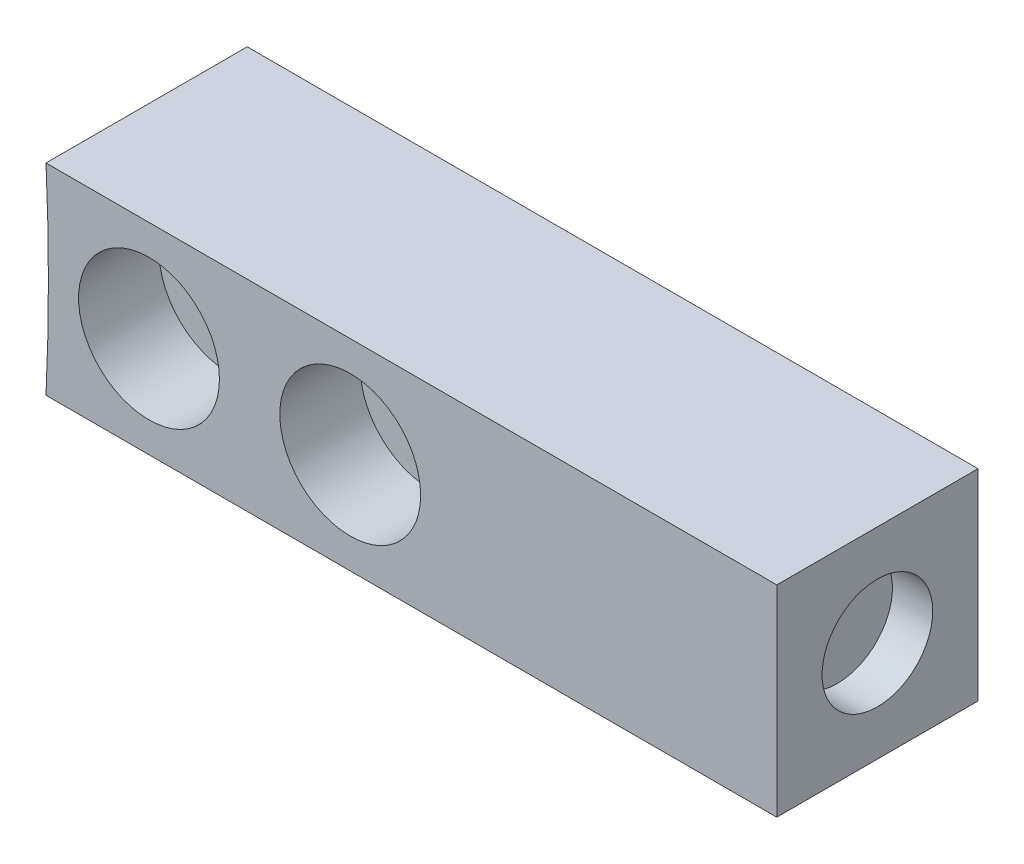
ISO-10303-21;
HEADER;
FILE_DESCRIPTION(('STEP AP214'),'2;1');
FILE_NAME('part.step','',(''),(''),'','','');
FILE_SCHEMA(('AUTOMOTIVE_DESIGN { 1 0 10303 214 1 1 1 1 }'));
ENDSEC;
DATA;
#1=APPLICATION_CONTEXT('core data for automotive mechanical design processes');
#2=APPLICATION_PROTOCOL_DEFINITION('international standard','automotive_design',2000,#1);
#3=PRODUCT_CONTEXT('',#1,'mechanical');
#4=PRODUCT('Part','Part','',(#3));
#5=PRODUCT_RELATED_PRODUCT_CATEGORY('part','',(#4));
#6=PRODUCT_DEFINITION_FORMATION('','',#4);
#7=PRODUCT_DEFINITION_CONTEXT('part definition',#1,'design');
#8=PRODUCT_DEFINITION('design','',#6,#7);
#9=PRODUCT_DEFINITION_SHAPE('','',#8);
#10=(LENGTH_UNIT() NAMED_UNIT(*) SI_UNIT(.MILLI.,.METRE.));
#11=(NAMED_UNIT(*) PLANE_ANGLE_UNIT() SI_UNIT($,.RADIAN.));
#12=(NAMED_UNIT(*) SI_UNIT($,.STERADIAN.) SOLID_ANGLE_UNIT());
#13=UNCERTAINTY_MEASURE_WITH_UNIT(LENGTH_MEASURE(1.E-05),#10,'distance_accuracy_value','');
#14=(GEOMETRIC_REPRESENTATION_CONTEXT(3) GLOBAL_UNCERTAINTY_ASSIGNED_CONTEXT((#13)) GLOBAL_UNIT_ASSIGNED_CONTEXT((#10,
#11,#12)) REPRESENTATION_CONTEXT('',''));
#15=CARTESIAN_POINT('',(0.,0.,0.));
#16=DIRECTION('',(0.,0.,1.));
#17=DIRECTION('',(1.,0.,0.));
#18=AXIS2_PLACEMENT_3D('',#15,#16,#17);
#19=CARTESIAN_POINT('',(110.,0.,10.));
#20=DIRECTION('',(0.,0.,-1.));
#21=DIRECTION('',(-1.,0.,0.));
#22=AXIS2_PLACEMENT_3D('',#19,#20,#21);
#23=CYLINDRICAL_SURFACE('',#22,1.75);
#24=CARTESIAN_POINT('',(110.,0.,0.));
#25=DIRECTION('',(0.,0.,1.));
#26=DIRECTION('',(1.,0.,0.));
#27=AXIS2_PLACEMENT_3D('',#24,#25,#26);
#28=CIRCLE('',#27,1.75);
#29=CARTESIAN_POINT('',(111.75,0.,0.));
#30=VERTEX_POINT('',#29);
#31=EDGE_CURVE('E115',#30,#30,#28,.T.);
#32=ORIENTED_EDGE('',*,*,#31,.F.);
#33=EDGE_LOOP('',(#32));
#34=FACE_BOUND('',#33,.T.);
#35=CARTESIAN_POINT('',(110.,0.,6.));
#36=DIRECTION('',(0.,0.,1.));
#37=DIRECTION('',(1.,0.,0.));
#38=AXIS2_PLACEMENT_3D('',#35,#36,#37);
#39=CIRCLE('',#38,1.75);
#40=CARTESIAN_POINT('',(111.75,0.,6.));
#41=VERTEX_POINT('',#40);
#42=EDGE_CURVE('E43',#41,#41,#39,.T.);
#43=ORIENTED_EDGE('',*,*,#42,.T.);
#44=EDGE_LOOP('',(#43));
#45=FACE_BOUND('',#44,.T.);
#46=ADVANCED_FACE('F39',(#34,#45),#23,.F.);
#47=CARTESIAN_POINT('',(120.,0.,10.));
#48=DIRECTION('',(0.,0.,-1.));
#49=DIRECTION('',(-1.,0.,0.));
#50=AXIS2_PLACEMENT_3D('',#47,#48,#49);
#51=CYLINDRICAL_SURFACE('',#50,1.75);
#52=CARTESIAN_POINT('',(120.,0.,0.));
#53=DIRECTION('',(0.,0.,1.));
#54=DIRECTION('',(1.,0.,0.));
#55=AXIS2_PLACEMENT_3D('',#52,#53,#54);
#56=CIRCLE('',#55,1.75);
#57=CARTESIAN_POINT('',(121.75,0.,0.));
#58=VERTEX_POINT('',#57);
#59=EDGE_CURVE('E156',#58,#58,#56,.T.);
#60=ORIENTED_EDGE('',*,*,#59,.F.);
#61=EDGE_LOOP('',(#60));
#62=FACE_BOUND('',#61,.T.);
#63=CARTESIAN_POINT('',(120.,0.,6.));
#64=DIRECTION('',(0.,0.,1.));
#65=DIRECTION('',(1.,0.,0.));
#66=AXIS2_PLACEMENT_3D('',#63,#64,#65);
#67=CIRCLE('',#66,1.75);
#68=CARTESIAN_POINT('',(121.75,0.,6.));
#69=VERTEX_POINT('',#68);
#70=EDGE_CURVE('E125',#69,#69,#67,.T.);
#71=ORIENTED_EDGE('',*,*,#70,.T.);
#72=EDGE_LOOP('',(#71));
#73=FACE_BOUND('',#72,.T.);
#74=ADVANCED_FACE('F173',(#62,#73),#51,.F.);
#75=CARTESIAN_POINT('',(0.,0.,10.));
#76=DIRECTION('',(0.,0.,-1.));
#77=DIRECTION('',(-1.,0.,0.));
#78=AXIS2_PLACEMENT_3D('',#75,#76,#77);
#79=PLANE('',#78);
#80=CARTESIAN_POINT('',(110.,0.,10.));
#81=DIRECTION('',(0.,0.,1.));
#82=DIRECTION('',(1.,0.,0.));
#83=AXIS2_PLACEMENT_3D('',#80,#81,#82);
#84=CIRCLE('',#83,3.50000000000001);
#85=CARTESIAN_POINT('',(113.5,0.,10.));
#86=VERTEX_POINT('',#85);
#87=EDGE_CURVE('E136',#86,#86,#84,.T.);
#88=ORIENTED_EDGE('',*,*,#87,.F.);
#89=EDGE_LOOP('',(#88));
#90=FACE_BOUND('',#89,.T.);
#91=CARTESIAN_POINT('',(120.,0.,10.));
#92=DIRECTION('',(0.,0.,1.));
#93=DIRECTION('',(1.,0.,0.));
#94=AXIS2_PLACEMENT_3D('',#91,#92,#93);
#95=CIRCLE('',#94,3.50000000000001);
#96=CARTESIAN_POINT('',(123.5,0.,10.));
#97=VERTEX_POINT('',#96);
#98=EDGE_CURVE('E148',#97,#97,#95,.T.);
#99=ORIENTED_EDGE('',*,*,#98,.F.);
#100=EDGE_LOOP('',(#99));
#101=FACE_BOUND('',#100,.T.);
#102=CARTESIAN_POINT('',(0.,0.,10.));
#103=DIRECTION('',(0.,0.,-1.));
#104=DIRECTION('',(-1.,0.,0.));
#105=AXIS2_PLACEMENT_3D('',#102,#103,#104);
#106=CIRCLE('',#105,105.);
#107=CARTESIAN_POINT('',(104.880884817015,5.,10.));
#108=VERTEX_POINT('',#107);
#109=CARTESIAN_POINT('',(104.880884817015,-5.,10.));
#110=VERTEX_POINT('',#109);
#111=EDGE_CURVE('E94',#108,#110,#106,.T.);
#112=ORIENTED_EDGE('',*,*,#111,.T.);
#113=DIRECTION('',(1.,0.,0.));
#114=VECTOR('',#113,1.);
#115=CARTESIAN_POINT('',(104.880884817015,-5.,10.));
#116=LINE('',#115,#114);
#117=CARTESIAN_POINT('',(141.2,-5.,10.));
#118=VERTEX_POINT('',#117);
#119=EDGE_CURVE('E89',#110,#118,#116,.T.);
#120=ORIENTED_EDGE('',*,*,#119,.T.);
#121=DIRECTION('',(0.,1.,0.));
#122=VECTOR('',#121,1.);
#123=CARTESIAN_POINT('',(141.2,5.,10.));
#124=LINE('',#123,#122);
#125=CARTESIAN_POINT('',(141.2,5.,10.));
#126=VERTEX_POINT('',#125);
#127=EDGE_CURVE('E92',#118,#126,#124,.T.);
#128=ORIENTED_EDGE('',*,*,#127,.T.);
#129=DIRECTION('',(-1.,0.,0.));
#130=VECTOR('',#129,1.);
#131=CARTESIAN_POINT('',(104.880884817015,5.,10.));
#132=LINE('',#131,#130);
#133=EDGE_CURVE('E59',#126,#108,#132,.T.);
#134=ORIENTED_EDGE('',*,*,#133,.T.);
#135=EDGE_LOOP('',(#112,#120,#128,#134));
#136=FACE_BOUND('',#135,.T.);
#137=ADVANCED_FACE('F90',(#90,#101,#136),#79,.F.);
#138=CARTESIAN_POINT('',(0.,0.,0.));
#139=DIRECTION('',(0.,0.,-1.));
#140=DIRECTION('',(-1.,0.,0.));
#141=AXIS2_PLACEMENT_3D('',#138,#139,#140);
#142=PLANE('',#141);
#143=ORIENTED_EDGE('',*,*,#31,.T.);
#144=EDGE_LOOP('',(#143));
#145=FACE_BOUND('',#144,.T.);
#146=CARTESIAN_POINT('',(0.,0.,0.));
#147=DIRECTION('',(0.,0.,-1.));
#148=DIRECTION('',(-1.,0.,0.));
#149=AXIS2_PLACEMENT_3D('',#146,#147,#148);
#150=CIRCLE('',#149,105.);
#151=CARTESIAN_POINT('',(104.880884817015,5.,0.));
#152=VERTEX_POINT('',#151);
#153=CARTESIAN_POINT('',(104.880884817015,-5.,0.));
#154=VERTEX_POINT('',#153);
#155=EDGE_CURVE('E111',#152,#154,#150,.T.);
#156=ORIENTED_EDGE('',*,*,#155,.F.);
#157=DIRECTION('',(-1.,0.,0.));
#158=VECTOR('',#157,1.);
#159=CARTESIAN_POINT('',(104.880884817015,5.,0.));
#160=LINE('',#159,#158);
#161=CARTESIAN_POINT('',(141.2,5.,0.));
#162=VERTEX_POINT('',#161);
#163=EDGE_CURVE('E82',#162,#152,#160,.T.);
#164=ORIENTED_EDGE('',*,*,#163,.F.);
#165=DIRECTION('',(0.,1.,0.));
#166=VECTOR('',#165,1.);
#167=CARTESIAN_POINT('',(141.2,5.,0.));
#168=LINE('',#167,#166);
#169=CARTESIAN_POINT('',(141.2,-5.,0.));
#170=VERTEX_POINT('',#169);
#171=EDGE_CURVE('E76',#170,#162,#168,.T.);
#172=ORIENTED_EDGE('',*,*,#171,.F.);
#173=DIRECTION('',(1.,0.,0.));
#174=VECTOR('',#173,1.);
#175=CARTESIAN_POINT('',(104.880884817015,-5.,0.));
#176=LINE('',#175,#174);
#177=EDGE_CURVE('E99',#154,#170,#176,.T.);
#178=ORIENTED_EDGE('',*,*,#177,.F.);
#179=EDGE_LOOP('',(#156,#164,#172,#178));
#180=FACE_BOUND('',#179,.T.);
#181=ORIENTED_EDGE('',*,*,#59,.T.);
#182=EDGE_LOOP('',(#181));
#183=FACE_BOUND('',#182,.T.);
#184=ADVANCED_FACE('F168',(#145,#180,#183),#142,.T.);
#185=CARTESIAN_POINT('',(0.,0.,10.));
#186=DIRECTION('',(0.,0.,-1.));
#187=DIRECTION('',(-1.,0.,0.));
#188=AXIS2_PLACEMENT_3D('',#185,#186,#187);
#189=CYLINDRICAL_SURFACE('',#188,105.);
#190=ORIENTED_EDGE('',*,*,#155,.T.);
#191=DIRECTION('',(0.,0.,-1.));
#192=VECTOR('',#191,1.);
#193=CARTESIAN_POINT('',(104.880884817015,-5.,10.));
#194=LINE('',#193,#192);
#195=EDGE_CURVE('E11',#110,#154,#194,.T.);
#196=ORIENTED_EDGE('',*,*,#195,.F.);
#197=ORIENTED_EDGE('',*,*,#111,.F.);
#198=DIRECTION('',(0.,0.,-1.));
#199=VECTOR('',#198,1.);
#200=CARTESIAN_POINT('',(104.880884817015,5.,10.));
#201=LINE('',#200,#199);
#202=EDGE_CURVE('E107',#108,#152,#201,.T.);
#203=ORIENTED_EDGE('',*,*,#202,.T.);
#204=EDGE_LOOP('',(#190,#196,#197,#203));
#205=FACE_BOUND('',#204,.T.);
#206=ADVANCED_FACE('F41',(#205),#189,.F.);
#207=CARTESIAN_POINT('',(104.880884817015,-5.,10.));
#208=DIRECTION('',(0.,1.,0.));
#209=DIRECTION('',(-1.,0.,0.));
#210=AXIS2_PLACEMENT_3D('',#207,#208,#209);
#211=PLANE('',#210);
#212=ORIENTED_EDGE('',*,*,#177,.T.);
#213=DIRECTION('',(0.,0.,-1.));
#214=VECTOR('',#213,1.);
#215=CARTESIAN_POINT('',(141.2,-5.,10.));
#216=LINE('',#215,#214);
#217=EDGE_CURVE('E50',#118,#170,#216,.T.);
#218=ORIENTED_EDGE('',*,*,#217,.F.);
#219=ORIENTED_EDGE('',*,*,#119,.F.);
#220=ORIENTED_EDGE('',*,*,#195,.T.);
#221=EDGE_LOOP('',(#212,#218,#219,#220));
#222=FACE_BOUND('',#221,.T.);
#223=ADVANCED_FACE('F98',(#222),#211,.F.);
#224=CARTESIAN_POINT('',(141.2,5.,10.));
#225=DIRECTION('',(-1.,0.,0.));
#226=DIRECTION('',(0.,0.,1.));
#227=AXIS2_PLACEMENT_3D('',#224,#225,#226);
#228=PLANE('',#227);
#229=CARTESIAN_POINT('',(141.2,0.,5.));
#230=DIRECTION('',(1.,0.,0.));
#231=DIRECTION('',(0.,0.,-1.));
#232=AXIS2_PLACEMENT_3D('',#229,#230,#231);
#233=CIRCLE('',#232,2.75);
#234=CARTESIAN_POINT('',(141.2,0.,2.25));
#235=VERTEX_POINT('',#234);
#236=EDGE_CURVE('E134',#235,#235,#233,.T.);
#237=ORIENTED_EDGE('',*,*,#236,.F.);
#238=EDGE_LOOP('',(#237));
#239=FACE_BOUND('',#238,.T.);
#240=ORIENTED_EDGE('',*,*,#171,.T.);
#241=DIRECTION('',(0.,0.,-1.));
#242=VECTOR('',#241,1.);
#243=CARTESIAN_POINT('',(141.2,5.,10.));
#244=LINE('',#243,#242);
#245=EDGE_CURVE('E101',#126,#162,#244,.T.);
#246=ORIENTED_EDGE('',*,*,#245,.F.);
#247=ORIENTED_EDGE('',*,*,#127,.F.);
#248=ORIENTED_EDGE('',*,*,#217,.T.);
#249=EDGE_LOOP('',(#240,#246,#247,#248));
#250=FACE_BOUND('',#249,.T.);
#251=ADVANCED_FACE('F103',(#239,#250),#228,.F.);
#252=CARTESIAN_POINT('',(104.880884817015,5.,10.));
#253=DIRECTION('',(0.,-1.,0.));
#254=DIRECTION('',(1.,0.,0.));
#255=AXIS2_PLACEMENT_3D('',#252,#253,#254);
#256=PLANE('',#255);
#257=ORIENTED_EDGE('',*,*,#163,.T.);
#258=ORIENTED_EDGE('',*,*,#202,.F.);
#259=ORIENTED_EDGE('',*,*,#133,.F.);
#260=ORIENTED_EDGE('',*,*,#245,.T.);
#261=EDGE_LOOP('',(#257,#258,#259,#260));
#262=FACE_BOUND('',#261,.T.);
#263=ADVANCED_FACE('F202',(#262),#256,.F.);
#264=CARTESIAN_POINT('',(139.2,0.,5.));
#265=DIRECTION('',(1.,0.,0.));
#266=DIRECTION('',(0.,0.,-1.));
#267=AXIS2_PLACEMENT_3D('',#264,#265,#266);
#268=CYLINDRICAL_SURFACE('',#267,2.75);
#269=CARTESIAN_POINT('',(139.2,0.,5.));
#270=DIRECTION('',(1.,0.,0.));
#271=DIRECTION('',(0.,0.,-1.));
#272=AXIS2_PLACEMENT_3D('',#269,#270,#271);
#273=CIRCLE('',#272,2.75);
#274=CARTESIAN_POINT('',(139.2,0.,2.25));
#275=VERTEX_POINT('',#274);
#276=EDGE_CURVE('E152',#275,#275,#273,.T.);
#277=ORIENTED_EDGE('',*,*,#276,.F.);
#278=EDGE_LOOP('',(#277));
#279=FACE_BOUND('',#278,.T.);
#280=ORIENTED_EDGE('',*,*,#236,.T.);
#281=EDGE_LOOP('',(#280));
#282=FACE_BOUND('',#281,.T.);
#283=ADVANCED_FACE('F198',(#279,#282),#268,.F.);
#284=CARTESIAN_POINT('',(139.2,0.,5.));
#285=DIRECTION('',(1.,0.,0.));
#286=DIRECTION('',(0.,0.,-1.));
#287=AXIS2_PLACEMENT_3D('',#284,#285,#286);
#288=PLANE('',#287);
#289=ORIENTED_EDGE('',*,*,#276,.T.);
#290=EDGE_LOOP('',(#289));
#291=FACE_BOUND('',#290,.T.);
#292=ADVANCED_FACE('F194',(#291),#288,.T.);
#293=CARTESIAN_POINT('',(120.,0.,6.));
#294=DIRECTION('',(0.,0.,1.));
#295=DIRECTION('',(1.,0.,0.));
#296=AXIS2_PLACEMENT_3D('',#293,#294,#295);
#297=CYLINDRICAL_SURFACE('',#296,3.50000000000001);
#298=CARTESIAN_POINT('',(120.,0.,6.));
#299=DIRECTION('',(0.,0.,1.));
#300=DIRECTION('',(1.,0.,0.));
#301=AXIS2_PLACEMENT_3D('',#298,#299,#300);
#302=CIRCLE('',#301,3.50000000000001);
#303=CARTESIAN_POINT('',(123.5,0.,6.));
#304=VERTEX_POINT('',#303);
#305=EDGE_CURVE('E142',#304,#304,#302,.T.);
#306=ORIENTED_EDGE('',*,*,#305,.F.);
#307=EDGE_LOOP('',(#306));
#308=FACE_BOUND('',#307,.T.);
#309=ORIENTED_EDGE('',*,*,#98,.T.);
#310=EDGE_LOOP('',(#309));
#311=FACE_BOUND('',#310,.T.);
#312=ADVANCED_FACE('F190',(#308,#311),#297,.F.);
#313=CARTESIAN_POINT('',(120.,0.,6.));
#314=DIRECTION('',(0.,0.,1.));
#315=DIRECTION('',(1.,0.,0.));
#316=AXIS2_PLACEMENT_3D('',#313,#314,#315);
#317=PLANE('',#316);
#318=ORIENTED_EDGE('',*,*,#70,.F.);
#319=EDGE_LOOP('',(#318));
#320=FACE_BOUND('',#319,.T.);
#321=ORIENTED_EDGE('',*,*,#305,.T.);
#322=EDGE_LOOP('',(#321));
#323=FACE_BOUND('',#322,.T.);
#324=ADVANCED_FACE('F184',(#320,#323),#317,.T.);
#325=CARTESIAN_POINT('',(110.,0.,6.));
#326=DIRECTION('',(0.,0.,1.));
#327=DIRECTION('',(1.,0.,0.));
#328=AXIS2_PLACEMENT_3D('',#325,#326,#327);
#329=CYLINDRICAL_SURFACE('',#328,3.50000000000001);
#330=CARTESIAN_POINT('',(110.,0.,6.));
#331=DIRECTION('',(0.,0.,1.));
#332=DIRECTION('',(1.,0.,0.));
#333=AXIS2_PLACEMENT_3D('',#330,#331,#332);
#334=CIRCLE('',#333,3.50000000000001);
#335=CARTESIAN_POINT('',(113.5,0.,6.));
#336=VERTEX_POINT('',#335);
#337=EDGE_CURVE('E128',#336,#336,#334,.T.);
#338=ORIENTED_EDGE('',*,*,#337,.F.);
#339=EDGE_LOOP('',(#338));
#340=FACE_BOUND('',#339,.T.);
#341=ORIENTED_EDGE('',*,*,#87,.T.);
#342=EDGE_LOOP('',(#341));
#343=FACE_BOUND('',#342,.T.);
#344=ADVANCED_FACE('F179',(#340,#343),#329,.F.);
#345=CARTESIAN_POINT('',(110.,0.,6.));
#346=DIRECTION('',(0.,0.,1.));
#347=DIRECTION('',(1.,0.,0.));
#348=AXIS2_PLACEMENT_3D('',#345,#346,#347);
#349=PLANE('',#348);
#350=ORIENTED_EDGE('',*,*,#42,.F.);
#351=EDGE_LOOP('',(#350));
#352=FACE_BOUND('',#351,.T.);
#353=ORIENTED_EDGE('',*,*,#337,.T.);
#354=EDGE_LOOP('',(#353));
#355=FACE_BOUND('',#354,.T.);
#356=ADVANCED_FACE('F177',(#352,#355),#349,.T.);
#357=CLOSED_SHELL('',(#46,#74,#137,#184,#206,#223,#251,#263,#283,#292,#312,#324,#344,#356));
#358=MANIFOLD_SOLID_BREP('B2',#357);
#359=ADVANCED_BREP_SHAPE_REPRESENTATION('',(#18,#358),#14);
#360=SHAPE_DEFINITION_REPRESENTATION(#9,#359);
ENDSEC;
END-ISO-10303-21;
